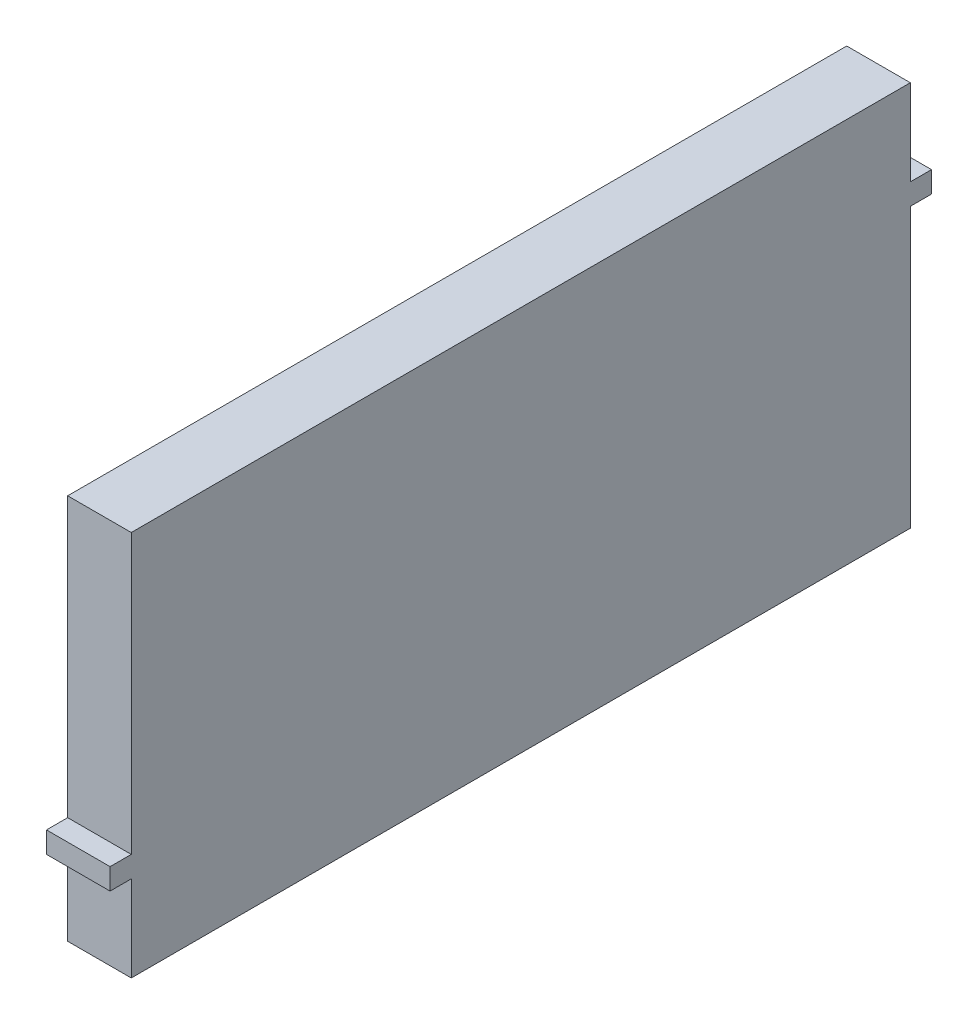
ISO-10303-21;
HEADER;
FILE_DESCRIPTION(('STEP AP214'),'2;1');
FILE_NAME('part.step','',(''),(''),'','','');
FILE_SCHEMA(('AUTOMOTIVE_DESIGN { 1 0 10303 214 1 1 1 1 }'));
ENDSEC;
DATA;
#1=APPLICATION_CONTEXT('core data for automotive mechanical design processes');
#2=APPLICATION_PROTOCOL_DEFINITION('international standard','automotive_design',2000,#1);
#3=PRODUCT_CONTEXT('',#1,'mechanical');
#4=PRODUCT('Part','Part','',(#3));
#5=PRODUCT_RELATED_PRODUCT_CATEGORY('part','',(#4));
#6=PRODUCT_DEFINITION_FORMATION('','',#4);
#7=PRODUCT_DEFINITION_CONTEXT('part definition',#1,'design');
#8=PRODUCT_DEFINITION('design','',#6,#7);
#9=PRODUCT_DEFINITION_SHAPE('','',#8);
#10=(LENGTH_UNIT() NAMED_UNIT(*) SI_UNIT(.MILLI.,.METRE.));
#11=(NAMED_UNIT(*) PLANE_ANGLE_UNIT() SI_UNIT($,.RADIAN.));
#12=(NAMED_UNIT(*) SI_UNIT($,.STERADIAN.) SOLID_ANGLE_UNIT());
#13=UNCERTAINTY_MEASURE_WITH_UNIT(LENGTH_MEASURE(1.E-05),#10,'distance_accuracy_value','');
#14=(GEOMETRIC_REPRESENTATION_CONTEXT(3) GLOBAL_UNCERTAINTY_ASSIGNED_CONTEXT((#13)) GLOBAL_UNIT_ASSIGNED_CONTEXT((#10,
#11,#12)) REPRESENTATION_CONTEXT('',''));
#15=CARTESIAN_POINT('',(0.,0.,0.));
#16=DIRECTION('',(0.,0.,1.));
#17=DIRECTION('',(1.,0.,0.));
#18=AXIS2_PLACEMENT_3D('',#15,#16,#17);
#19=CARTESIAN_POINT('',(388.468402146903,419.517958454733,679.24994407791));
#20=DIRECTION('',(0.,0.,-1.));
#21=DIRECTION('',(-1.,0.,0.));
#22=AXIS2_PLACEMENT_3D('',#19,#20,#21);
#23=PLANE('',#22);
#24=DIRECTION('',(0.,-1.,0.));
#25=VECTOR('',#24,1.);
#26=CARTESIAN_POINT('',(252.542706630704,419.517958454733,679.24994407791));
#27=LINE('',#26,#25);
#28=CARTESIAN_POINT('',(252.542706630704,419.517958454733,679.24994407791));
#29=VERTEX_POINT('',#28);
#30=CARTESIAN_POINT('',(252.542706630704,377.766708454733,679.24994407791));
#31=VERTEX_POINT('',#30);
#32=EDGE_CURVE('E168',#29,#31,#27,.T.);
#33=ORIENTED_EDGE('',*,*,#32,.F.);
#34=DIRECTION('',(-1.,0.,0.));
#35=VECTOR('',#34,1.);
#36=CARTESIAN_POINT('',(388.468402146903,419.517958454733,679.24994407791));
#37=LINE('',#36,#35);
#38=CARTESIAN_POINT('',(243.017706630704,419.517958454733,679.24994407791));
#39=VERTEX_POINT('',#38);
#40=EDGE_CURVE('E37',#29,#39,#37,.T.);
#41=ORIENTED_EDGE('',*,*,#40,.T.);
#42=DIRECTION('',(0.,-1.,0.));
#43=VECTOR('',#42,1.);
#44=CARTESIAN_POINT('',(243.017706630704,419.517958454733,679.24994407791));
#45=LINE('',#44,#43);
#46=CARTESIAN_POINT('',(243.017706630704,377.766708454733,679.24994407791));
#47=VERTEX_POINT('',#46);
#48=EDGE_CURVE('E176',#39,#47,#45,.T.);
#49=ORIENTED_EDGE('',*,*,#48,.T.);
#50=DIRECTION('',(-1.,0.,0.));
#51=VECTOR('',#50,1.);
#52=CARTESIAN_POINT('',(388.468402146903,377.766708454733,679.24994407791));
#53=LINE('',#52,#51);
#54=EDGE_CURVE('E104',#31,#47,#53,.T.);
#55=ORIENTED_EDGE('',*,*,#54,.F.);
#56=EDGE_LOOP('',(#33,#41,#49,#55));
#57=FACE_BOUND('',#56,.T.);
#58=ADVANCED_FACE('F33',(#57),#23,.F.);
#59=CARTESIAN_POINT('',(388.468402146903,377.766708454733,679.24994407791));
#60=DIRECTION('',(0.,-1.,0.));
#61=DIRECTION('',(0.,0.,-1.));
#62=AXIS2_PLACEMENT_3D('',#59,#60,#61);
#63=PLANE('',#62);
#64=DIRECTION('',(0.,0.,1.));
#65=VECTOR('',#64,1.);
#66=CARTESIAN_POINT('',(252.542706630704,377.766708454733,679.24994407791));
#67=LINE('',#66,#65);
#68=CARTESIAN_POINT('',(252.542706630704,377.766708454733,682.42494407791));
#69=VERTEX_POINT('',#68);
#70=EDGE_CURVE('E111',#31,#69,#67,.T.);
#71=ORIENTED_EDGE('',*,*,#70,.F.);
#72=ORIENTED_EDGE('',*,*,#54,.T.);
#73=DIRECTION('',(0.,0.,1.));
#74=VECTOR('',#73,1.);
#75=CARTESIAN_POINT('',(243.017706630704,377.766708454733,679.24994407791));
#76=LINE('',#75,#74);
#77=CARTESIAN_POINT('',(243.017706630704,377.766708454733,682.42494407791));
#78=VERTEX_POINT('',#77);
#79=EDGE_CURVE('E175',#47,#78,#76,.T.);
#80=ORIENTED_EDGE('',*,*,#79,.T.);
#81=DIRECTION('',(-1.,0.,0.));
#82=VECTOR('',#81,1.);
#83=CARTESIAN_POINT('',(388.468402146903,377.766708454733,682.42494407791));
#84=LINE('',#83,#82);
#85=EDGE_CURVE('E177',#69,#78,#84,.T.);
#86=ORIENTED_EDGE('',*,*,#85,.F.);
#87=EDGE_LOOP('',(#71,#72,#80,#86));
#88=FACE_BOUND('',#87,.T.);
#89=ADVANCED_FACE('F226',(#88),#63,.F.);
#90=CARTESIAN_POINT('',(388.468402146903,377.766708454733,682.42494407791));
#91=DIRECTION('',(0.,0.,-1.));
#92=DIRECTION('',(-1.,0.,0.));
#93=AXIS2_PLACEMENT_3D('',#90,#91,#92);
#94=PLANE('',#93);
#95=DIRECTION('',(0.,-1.,0.));
#96=VECTOR('',#95,1.);
#97=CARTESIAN_POINT('',(252.542706630704,377.766708454733,682.42494407791));
#98=LINE('',#97,#96);
#99=CARTESIAN_POINT('',(252.542706630704,374.591708454733,682.42494407791));
#100=VERTEX_POINT('',#99);
#101=EDGE_CURVE('E164',#69,#100,#98,.T.);
#102=ORIENTED_EDGE('',*,*,#101,.F.);
#103=ORIENTED_EDGE('',*,*,#85,.T.);
#104=DIRECTION('',(0.,-1.,0.));
#105=VECTOR('',#104,1.);
#106=CARTESIAN_POINT('',(243.017706630704,377.766708454733,682.42494407791));
#107=LINE('',#106,#105);
#108=CARTESIAN_POINT('',(243.017706630704,374.591708454733,682.42494407791));
#109=VERTEX_POINT('',#108);
#110=EDGE_CURVE('E179',#78,#109,#107,.T.);
#111=ORIENTED_EDGE('',*,*,#110,.T.);
#112=DIRECTION('',(-1.,0.,0.));
#113=VECTOR('',#112,1.);
#114=CARTESIAN_POINT('',(388.468402146903,374.591708454733,682.42494407791));
#115=LINE('',#114,#113);
#116=EDGE_CURVE('E180',#100,#109,#115,.T.);
#117=ORIENTED_EDGE('',*,*,#116,.F.);
#118=EDGE_LOOP('',(#102,#103,#111,#117));
#119=FACE_BOUND('',#118,.T.);
#120=ADVANCED_FACE('F229',(#119),#94,.F.);
#121=CARTESIAN_POINT('',(388.468402146903,374.591708454733,682.42494407791));
#122=DIRECTION('',(0.,1.,0.));
#123=DIRECTION('',(0.,0.,1.));
#124=AXIS2_PLACEMENT_3D('',#121,#122,#123);
#125=PLANE('',#124);
#126=DIRECTION('',(0.,0.,-1.));
#127=VECTOR('',#126,1.);
#128=CARTESIAN_POINT('',(252.542706630704,374.591708454733,682.42494407791));
#129=LINE('',#128,#127);
#130=CARTESIAN_POINT('',(252.542706630704,374.591708454733,679.24994407791));
#131=VERTEX_POINT('',#130);
#132=EDGE_CURVE('E161',#100,#131,#129,.T.);
#133=ORIENTED_EDGE('',*,*,#132,.F.);
#134=ORIENTED_EDGE('',*,*,#116,.T.);
#135=DIRECTION('',(0.,0.,-1.));
#136=VECTOR('',#135,1.);
#137=CARTESIAN_POINT('',(243.017706630704,374.591708454733,682.42494407791));
#138=LINE('',#137,#136);
#139=CARTESIAN_POINT('',(243.017706630704,374.591708454733,679.24994407791));
#140=VERTEX_POINT('',#139);
#141=EDGE_CURVE('E182',#109,#140,#138,.T.);
#142=ORIENTED_EDGE('',*,*,#141,.T.);
#143=DIRECTION('',(-1.,0.,0.));
#144=VECTOR('',#143,1.);
#145=CARTESIAN_POINT('',(388.468402146903,374.591708454733,679.24994407791));
#146=LINE('',#145,#144);
#147=EDGE_CURVE('E183',#131,#140,#146,.T.);
#148=ORIENTED_EDGE('',*,*,#147,.F.);
#149=EDGE_LOOP('',(#133,#134,#142,#148));
#150=FACE_BOUND('',#149,.T.);
#151=ADVANCED_FACE('F231',(#150),#125,.F.);
#152=CARTESIAN_POINT('',(388.468402146903,361.732958454733,679.24994407791));
#153=DIRECTION('',(0.,0.,-1.));
#154=DIRECTION('',(-1.,0.,0.));
#155=AXIS2_PLACEMENT_3D('',#152,#153,#154);
#156=PLANE('',#155);
#157=DIRECTION('',(0.,-1.,0.));
#158=VECTOR('',#157,1.);
#159=CARTESIAN_POINT('',(252.542706630704,361.732958454733,679.24994407791));
#160=LINE('',#159,#158);
#161=CARTESIAN_POINT('',(252.542706630704,361.732958454733,679.24994407791));
#162=VERTEX_POINT('',#161);
#163=EDGE_CURVE('E158',#131,#162,#160,.T.);
#164=ORIENTED_EDGE('',*,*,#163,.F.);
#165=ORIENTED_EDGE('',*,*,#147,.T.);
#166=DIRECTION('',(0.,-1.,0.));
#167=VECTOR('',#166,1.);
#168=CARTESIAN_POINT('',(243.017706630704,361.732958454733,679.24994407791));
#169=LINE('',#168,#167);
#170=CARTESIAN_POINT('',(243.017706630704,361.732958454733,679.24994407791));
#171=VERTEX_POINT('',#170);
#172=EDGE_CURVE('E185',#140,#171,#169,.T.);
#173=ORIENTED_EDGE('',*,*,#172,.T.);
#174=DIRECTION('',(-1.,0.,0.));
#175=VECTOR('',#174,1.);
#176=CARTESIAN_POINT('',(388.468402146903,361.732958454733,679.24994407791));
#177=LINE('',#176,#175);
#178=EDGE_CURVE('E186',#162,#171,#177,.T.);
#179=ORIENTED_EDGE('',*,*,#178,.F.);
#180=EDGE_LOOP('',(#164,#165,#173,#179));
#181=FACE_BOUND('',#180,.T.);
#182=ADVANCED_FACE('F235',(#181),#156,.F.);
#183=CARTESIAN_POINT('',(388.468402146903,361.732958454733,562.56869407791));
#184=DIRECTION('',(0.,1.,0.));
#185=DIRECTION('',(0.,0.,1.));
#186=AXIS2_PLACEMENT_3D('',#183,#184,#185);
#187=PLANE('',#186);
#188=DIRECTION('',(0.,0.,-1.));
#189=VECTOR('',#188,1.);
#190=CARTESIAN_POINT('',(252.542706630704,361.732958454733,562.56869407791));
#191=LINE('',#190,#189);
#192=CARTESIAN_POINT('',(252.542706630704,361.732958454733,562.56869407791));
#193=VERTEX_POINT('',#192);
#194=EDGE_CURVE('E155',#162,#193,#191,.T.);
#195=ORIENTED_EDGE('',*,*,#194,.F.);
#196=ORIENTED_EDGE('',*,*,#178,.T.);
#197=DIRECTION('',(0.,0.,-1.));
#198=VECTOR('',#197,1.);
#199=CARTESIAN_POINT('',(243.017706630704,361.732958454733,562.56869407791));
#200=LINE('',#199,#198);
#201=CARTESIAN_POINT('',(243.017706630704,361.732958454733,562.56869407791));
#202=VERTEX_POINT('',#201);
#203=EDGE_CURVE('E188',#171,#202,#200,.T.);
#204=ORIENTED_EDGE('',*,*,#203,.T.);
#205=DIRECTION('',(-1.,0.,0.));
#206=VECTOR('',#205,1.);
#207=CARTESIAN_POINT('',(388.468402146903,361.732958454733,562.56869407791));
#208=LINE('',#207,#206);
#209=EDGE_CURVE('E189',#193,#202,#208,.T.);
#210=ORIENTED_EDGE('',*,*,#209,.F.);
#211=EDGE_LOOP('',(#195,#196,#204,#210));
#212=FACE_BOUND('',#211,.T.);
#213=ADVANCED_FACE('F240',(#212),#187,.F.);
#214=CARTESIAN_POINT('',(388.468402146903,403.484208454733,562.56869407791));
#215=DIRECTION('',(0.,0.,1.));
#216=DIRECTION('',(1.,0.,0.));
#217=AXIS2_PLACEMENT_3D('',#214,#215,#216);
#218=PLANE('',#217);
#219=DIRECTION('',(0.,1.,0.));
#220=VECTOR('',#219,1.);
#221=CARTESIAN_POINT('',(252.542706630704,403.484208454733,562.56869407791));
#222=LINE('',#221,#220);
#223=CARTESIAN_POINT('',(252.542706630704,403.484208454733,562.56869407791));
#224=VERTEX_POINT('',#223);
#225=EDGE_CURVE('E152',#193,#224,#222,.T.);
#226=ORIENTED_EDGE('',*,*,#225,.F.);
#227=ORIENTED_EDGE('',*,*,#209,.T.);
#228=DIRECTION('',(0.,1.,0.));
#229=VECTOR('',#228,1.);
#230=CARTESIAN_POINT('',(243.017706630704,403.484208454733,562.56869407791));
#231=LINE('',#230,#229);
#232=CARTESIAN_POINT('',(243.017706630704,403.484208454733,562.56869407791));
#233=VERTEX_POINT('',#232);
#234=EDGE_CURVE('E191',#202,#233,#231,.T.);
#235=ORIENTED_EDGE('',*,*,#234,.T.);
#236=DIRECTION('',(-1.,0.,0.));
#237=VECTOR('',#236,1.);
#238=CARTESIAN_POINT('',(388.468402146903,403.484208454733,562.56869407791));
#239=LINE('',#238,#237);
#240=EDGE_CURVE('E192',#224,#233,#239,.T.);
#241=ORIENTED_EDGE('',*,*,#240,.F.);
#242=EDGE_LOOP('',(#226,#227,#235,#241));
#243=FACE_BOUND('',#242,.T.);
#244=ADVANCED_FACE('F243',(#243),#218,.F.);
#245=CARTESIAN_POINT('',(388.468402146903,403.484208454733,562.56869407791));
#246=DIRECTION('',(0.,1.,0.));
#247=DIRECTION('',(0.,0.,1.));
#248=AXIS2_PLACEMENT_3D('',#245,#246,#247);
#249=PLANE('',#248);
#250=DIRECTION('',(0.,0.,-1.));
#251=VECTOR('',#250,1.);
#252=CARTESIAN_POINT('',(252.542706630704,403.484208454733,562.56869407791));
#253=LINE('',#252,#251);
#254=CARTESIAN_POINT('',(252.542706630704,403.484208454733,559.39369407791));
#255=VERTEX_POINT('',#254);
#256=EDGE_CURVE('E147',#224,#255,#253,.T.);
#257=ORIENTED_EDGE('',*,*,#256,.F.);
#258=ORIENTED_EDGE('',*,*,#240,.T.);
#259=DIRECTION('',(0.,0.,-1.));
#260=VECTOR('',#259,1.);
#261=CARTESIAN_POINT('',(243.017706630704,403.484208454733,562.56869407791));
#262=LINE('',#261,#260);
#263=CARTESIAN_POINT('',(243.017706630704,403.484208454733,559.39369407791));
#264=VERTEX_POINT('',#263);
#265=EDGE_CURVE('E194',#233,#264,#262,.T.);
#266=ORIENTED_EDGE('',*,*,#265,.T.);
#267=DIRECTION('',(-1.,0.,0.));
#268=VECTOR('',#267,1.);
#269=CARTESIAN_POINT('',(388.468402146903,403.484208454733,559.39369407791));
#270=LINE('',#269,#268);
#271=EDGE_CURVE('E195',#255,#264,#270,.T.);
#272=ORIENTED_EDGE('',*,*,#271,.F.);
#273=EDGE_LOOP('',(#257,#258,#266,#272));
#274=FACE_BOUND('',#273,.T.);
#275=ADVANCED_FACE('F247',(#274),#249,.F.);
#276=CARTESIAN_POINT('',(388.468402146903,403.484208454733,559.39369407791));
#277=DIRECTION('',(0.,0.,1.));
#278=DIRECTION('',(0.,-1.,0.));
#279=AXIS2_PLACEMENT_3D('',#276,#277,#278);
#280=PLANE('',#279);
#281=DIRECTION('',(0.,1.,0.));
#282=VECTOR('',#281,1.);
#283=CARTESIAN_POINT('',(252.542706630704,403.484208454733,559.39369407791));
#284=LINE('',#283,#282);
#285=CARTESIAN_POINT('',(252.542706630704,406.659208454733,559.39369407791));
#286=VERTEX_POINT('',#285);
#287=EDGE_CURVE('E145',#255,#286,#284,.T.);
#288=ORIENTED_EDGE('',*,*,#287,.F.);
#289=ORIENTED_EDGE('',*,*,#271,.T.);
#290=DIRECTION('',(0.,1.,0.));
#291=VECTOR('',#290,1.);
#292=CARTESIAN_POINT('',(243.017706630704,403.484208454733,559.39369407791));
#293=LINE('',#292,#291);
#294=CARTESIAN_POINT('',(243.017706630704,406.659208454733,559.39369407791));
#295=VERTEX_POINT('',#294);
#296=EDGE_CURVE('E197',#264,#295,#293,.T.);
#297=ORIENTED_EDGE('',*,*,#296,.T.);
#298=DIRECTION('',(-1.,0.,0.));
#299=VECTOR('',#298,1.);
#300=CARTESIAN_POINT('',(388.468402146903,406.659208454733,559.39369407791));
#301=LINE('',#300,#299);
#302=EDGE_CURVE('E198',#286,#295,#301,.T.);
#303=ORIENTED_EDGE('',*,*,#302,.F.);
#304=EDGE_LOOP('',(#288,#289,#297,#303));
#305=FACE_BOUND('',#304,.T.);
#306=ADVANCED_FACE('F251',(#305),#280,.F.);
#307=CARTESIAN_POINT('',(388.468402146903,406.659208454733,559.39369407791));
#308=DIRECTION('',(0.,-1.,0.));
#309=DIRECTION('',(0.,0.,-1.));
#310=AXIS2_PLACEMENT_3D('',#307,#308,#309);
#311=PLANE('',#310);
#312=DIRECTION('',(0.,0.,1.));
#313=VECTOR('',#312,1.);
#314=CARTESIAN_POINT('',(252.542706630704,406.659208454733,559.39369407791));
#315=LINE('',#314,#313);
#316=CARTESIAN_POINT('',(252.542706630704,406.659208454733,562.56869407791));
#317=VERTEX_POINT('',#316);
#318=EDGE_CURVE('E42',#286,#317,#315,.T.);
#319=ORIENTED_EDGE('',*,*,#318,.F.);
#320=ORIENTED_EDGE('',*,*,#302,.T.);
#321=DIRECTION('',(0.,0.,1.));
#322=VECTOR('',#321,1.);
#323=CARTESIAN_POINT('',(243.017706630704,406.659208454733,559.39369407791));
#324=LINE('',#323,#322);
#325=CARTESIAN_POINT('',(243.017706630704,406.659208454733,562.56869407791));
#326=VERTEX_POINT('',#325);
#327=EDGE_CURVE('E139',#295,#326,#324,.T.);
#328=ORIENTED_EDGE('',*,*,#327,.T.);
#329=DIRECTION('',(-1.,0.,0.));
#330=VECTOR('',#329,1.);
#331=CARTESIAN_POINT('',(388.468402146903,406.659208454733,562.56869407791));
#332=LINE('',#331,#330);
#333=EDGE_CURVE('E130',#317,#326,#332,.T.);
#334=ORIENTED_EDGE('',*,*,#333,.F.);
#335=EDGE_LOOP('',(#319,#320,#328,#334));
#336=FACE_BOUND('',#335,.T.);
#337=ADVANCED_FACE('F136',(#336),#311,.F.);
#338=CARTESIAN_POINT('',(388.468402146903,406.659208454733,562.56869407791));
#339=DIRECTION('',(0.,0.,1.));
#340=DIRECTION('',(0.,-1.,0.));
#341=AXIS2_PLACEMENT_3D('',#338,#339,#340);
#342=PLANE('',#341);
#343=DIRECTION('',(0.,1.,0.));
#344=VECTOR('',#343,1.);
#345=CARTESIAN_POINT('',(252.542706630704,406.659208454733,562.56869407791));
#346=LINE('',#345,#344);
#347=CARTESIAN_POINT('',(252.542706630704,419.517958454733,562.56869407791));
#348=VERTEX_POINT('',#347);
#349=EDGE_CURVE('E11',#317,#348,#346,.T.);
#350=ORIENTED_EDGE('',*,*,#349,.F.);
#351=ORIENTED_EDGE('',*,*,#333,.T.);
#352=DIRECTION('',(0.,1.,0.));
#353=VECTOR('',#352,1.);
#354=CARTESIAN_POINT('',(243.017706630704,406.659208454733,562.56869407791));
#355=LINE('',#354,#353);
#356=CARTESIAN_POINT('',(243.017706630704,419.517958454733,562.56869407791));
#357=VERTEX_POINT('',#356);
#358=EDGE_CURVE('E141',#326,#357,#355,.T.);
#359=ORIENTED_EDGE('',*,*,#358,.T.);
#360=DIRECTION('',(-1.,0.,0.));
#361=VECTOR('',#360,1.);
#362=CARTESIAN_POINT('',(388.468402146903,419.517958454733,562.56869407791));
#363=LINE('',#362,#361);
#364=EDGE_CURVE('E55',#348,#357,#363,.T.);
#365=ORIENTED_EDGE('',*,*,#364,.F.);
#366=EDGE_LOOP('',(#350,#351,#359,#365));
#367=FACE_BOUND('',#366,.T.);
#368=ADVANCED_FACE('F129',(#367),#342,.F.);
#369=CARTESIAN_POINT('',(388.468402146903,419.517958454733,679.24994407791));
#370=DIRECTION('',(0.,-1.,0.));
#371=DIRECTION('',(0.,0.,-1.));
#372=AXIS2_PLACEMENT_3D('',#369,#370,#371);
#373=PLANE('',#372);
#374=DIRECTION('',(0.,0.,1.));
#375=VECTOR('',#374,1.);
#376=CARTESIAN_POINT('',(252.542706630704,419.517958454733,679.24994407791));
#377=LINE('',#376,#375);
#378=EDGE_CURVE('E171',#348,#29,#377,.T.);
#379=ORIENTED_EDGE('',*,*,#378,.F.);
#380=ORIENTED_EDGE('',*,*,#364,.T.);
#381=DIRECTION('',(0.,0.,1.));
#382=VECTOR('',#381,1.);
#383=CARTESIAN_POINT('',(243.017706630704,419.517958454733,679.24994407791));
#384=LINE('',#383,#382);
#385=EDGE_CURVE('E173',#357,#39,#384,.T.);
#386=ORIENTED_EDGE('',*,*,#385,.T.);
#387=ORIENTED_EDGE('',*,*,#40,.F.);
#388=EDGE_LOOP('',(#379,#380,#386,#387));
#389=FACE_BOUND('',#388,.T.);
#390=ADVANCED_FACE('F221',(#389),#373,.F.);
#391=CARTESIAN_POINT('',(243.017706630704,0.,0.));
#392=DIRECTION('',(-1.,0.,0.));
#393=DIRECTION('',(0.,0.,1.));
#394=AXIS2_PLACEMENT_3D('',#391,#392,#393);
#395=PLANE('',#394);
#396=ORIENTED_EDGE('',*,*,#48,.F.);
#397=ORIENTED_EDGE('',*,*,#385,.F.);
#398=ORIENTED_EDGE('',*,*,#358,.F.);
#399=ORIENTED_EDGE('',*,*,#327,.F.);
#400=ORIENTED_EDGE('',*,*,#296,.F.);
#401=ORIENTED_EDGE('',*,*,#265,.F.);
#402=ORIENTED_EDGE('',*,*,#234,.F.);
#403=ORIENTED_EDGE('',*,*,#203,.F.);
#404=ORIENTED_EDGE('',*,*,#172,.F.);
#405=ORIENTED_EDGE('',*,*,#141,.F.);
#406=ORIENTED_EDGE('',*,*,#110,.F.);
#407=ORIENTED_EDGE('',*,*,#79,.F.);
#408=EDGE_LOOP('',(#396,#397,#398,#399,#400,#401,#402,#403,#404,#405,#406,#407));
#409=FACE_BOUND('',#408,.T.);
#410=ADVANCED_FACE('F223',(#409),#395,.T.);
#411=CARTESIAN_POINT('',(252.542706630704,377.766708454733,802.28119407791));
#412=DIRECTION('',(1.,0.,0.));
#413=DIRECTION('',(0.,0.,-1.));
#414=AXIS2_PLACEMENT_3D('',#411,#412,#413);
#415=PLANE('',#414);
#416=ORIENTED_EDGE('',*,*,#378,.T.);
#417=ORIENTED_EDGE('',*,*,#32,.T.);
#418=ORIENTED_EDGE('',*,*,#70,.T.);
#419=ORIENTED_EDGE('',*,*,#101,.T.);
#420=ORIENTED_EDGE('',*,*,#132,.T.);
#421=ORIENTED_EDGE('',*,*,#163,.T.);
#422=ORIENTED_EDGE('',*,*,#194,.T.);
#423=ORIENTED_EDGE('',*,*,#225,.T.);
#424=ORIENTED_EDGE('',*,*,#256,.T.);
#425=ORIENTED_EDGE('',*,*,#287,.T.);
#426=ORIENTED_EDGE('',*,*,#318,.T.);
#427=ORIENTED_EDGE('',*,*,#349,.T.);
#428=EDGE_LOOP('',(#416,#417,#418,#419,#420,#421,#422,#423,#424,#425,#426,#427));
#429=FACE_BOUND('',#428,.T.);
#430=ADVANCED_FACE('F35',(#429),#415,.T.);
#431=CLOSED_SHELL('',(#58,#89,#120,#151,#182,#213,#244,#275,#306,#337,#368,#390,#410,#430));
#432=MANIFOLD_SOLID_BREP('B2',#431);
#433=ADVANCED_BREP_SHAPE_REPRESENTATION('',(#18,#432),#14);
#434=SHAPE_DEFINITION_REPRESENTATION(#9,#433);
ENDSEC;
END-ISO-10303-21;
